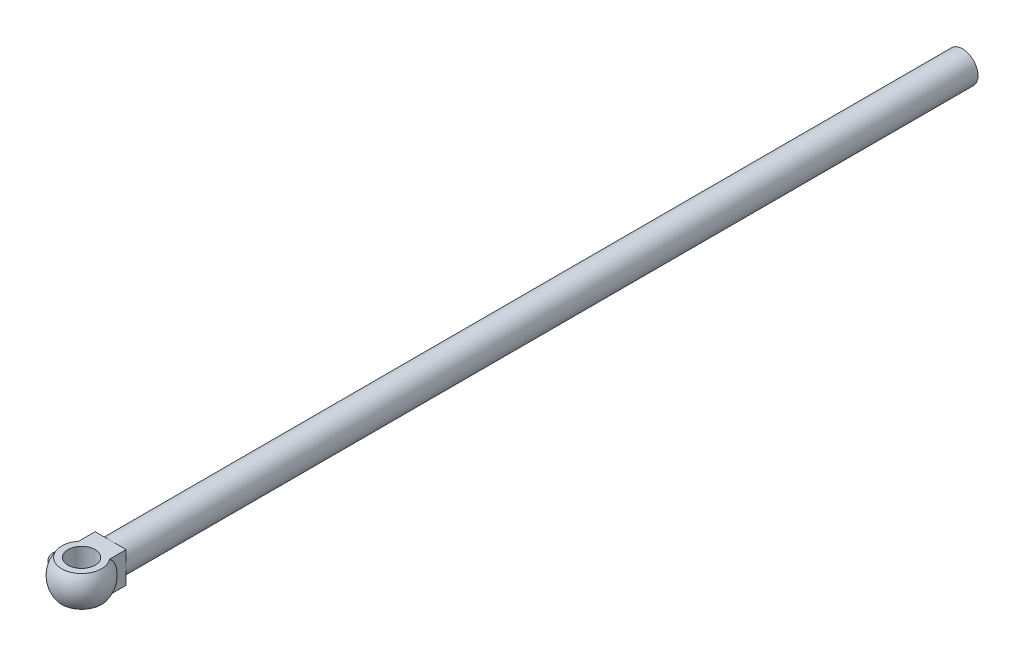
ISO-10303-21;
HEADER;
FILE_DESCRIPTION(('STEP AP214'),'2;1');
FILE_NAME('part.step','',(''),(''),'','','');
FILE_SCHEMA(('AUTOMOTIVE_DESIGN { 1 0 10303 214 1 1 1 1 }'));
ENDSEC;
DATA;
#1=APPLICATION_CONTEXT('core data for automotive mechanical design processes');
#2=APPLICATION_PROTOCOL_DEFINITION('international standard','automotive_design',2000,#1);
#3=PRODUCT_CONTEXT('',#1,'mechanical');
#4=PRODUCT('Part','Part','',(#3));
#5=PRODUCT_RELATED_PRODUCT_CATEGORY('part','',(#4));
#6=PRODUCT_DEFINITION_FORMATION('','',#4);
#7=PRODUCT_DEFINITION_CONTEXT('part definition',#1,'design');
#8=PRODUCT_DEFINITION('design','',#6,#7);
#9=PRODUCT_DEFINITION_SHAPE('','',#8);
#10=(LENGTH_UNIT() NAMED_UNIT(*) SI_UNIT(.MILLI.,.METRE.));
#11=(NAMED_UNIT(*) PLANE_ANGLE_UNIT() SI_UNIT($,.RADIAN.));
#12=(NAMED_UNIT(*) SI_UNIT($,.STERADIAN.) SOLID_ANGLE_UNIT());
#13=UNCERTAINTY_MEASURE_WITH_UNIT(LENGTH_MEASURE(1.E-05),#10,'distance_accuracy_value','');
#14=(GEOMETRIC_REPRESENTATION_CONTEXT(3) GLOBAL_UNCERTAINTY_ASSIGNED_CONTEXT((#13)) GLOBAL_UNIT_ASSIGNED_CONTEXT((#10,
#11,#12)) REPRESENTATION_CONTEXT('',''));
#15=CARTESIAN_POINT('',(0.,0.,0.));
#16=DIRECTION('',(0.,0.,1.));
#17=DIRECTION('',(1.,0.,0.));
#18=AXIS2_PLACEMENT_3D('',#15,#16,#17);
#19=CARTESIAN_POINT('',(0.,0.,-75.));
#20=DIRECTION('',(0.,0.,-1.));
#21=DIRECTION('',(-1.,0.,0.));
#22=AXIS2_PLACEMENT_3D('',#19,#20,#21);
#23=PLANE('',#22);
#24=CARTESIAN_POINT('',(0.,0.,-75.));
#25=DIRECTION('',(0.,0.,-1.));
#26=DIRECTION('',(-1.,0.,0.));
#27=AXIS2_PLACEMENT_3D('',#24,#25,#26);
#28=CIRCLE('',#27,40.);
#29=CARTESIAN_POINT('',(-40.,0.,-75.));
#30=VERTEX_POINT('',#29);
#31=CARTESIAN_POINT('',(0.,40.,-75.));
#32=VERTEX_POINT('',#31);
#33=EDGE_CURVE('E49',#30,#32,#28,.T.);
#34=ORIENTED_EDGE('',*,*,#33,.F.);
#35=DIRECTION('',(0.,-1.,0.));
#36=VECTOR('',#35,1.);
#37=CARTESIAN_POINT('',(-40.,-40.,-75.));
#38=LINE('',#37,#36);
#39=CARTESIAN_POINT('',(-40.,40.,-75.));
#40=VERTEX_POINT('',#39);
#41=EDGE_CURVE('E99',#40,#30,#38,.T.);
#42=ORIENTED_EDGE('',*,*,#41,.F.);
#43=DIRECTION('',(-1.,0.,0.));
#44=VECTOR('',#43,1.);
#45=CARTESIAN_POINT('',(-40.,40.,-75.));
#46=LINE('',#45,#44);
#47=EDGE_CURVE('E113',#32,#40,#46,.T.);
#48=ORIENTED_EDGE('',*,*,#47,.F.);
#49=EDGE_LOOP('',(#34,#42,#48));
#50=FACE_BOUND('',#49,.T.);
#51=ADVANCED_FACE('F38',(#50),#23,.T.);
#52=CARTESIAN_POINT('',(40.,0.,-75.));
#53=VERTEX_POINT('',#52);
#54=EDGE_CURVE('E11',#32,#53,#28,.T.);
#55=ORIENTED_EDGE('',*,*,#54,.F.);
#56=CARTESIAN_POINT('',(40.,40.,-75.));
#57=VERTEX_POINT('',#56);
#58=EDGE_CURVE('E142',#57,#32,#46,.T.);
#59=ORIENTED_EDGE('',*,*,#58,.F.);
#60=DIRECTION('',(0.,1.,0.));
#61=VECTOR('',#60,1.);
#62=CARTESIAN_POINT('',(40.,-40.,-75.));
#63=LINE('',#62,#61);
#64=EDGE_CURVE('E148',#53,#57,#63,.T.);
#65=ORIENTED_EDGE('',*,*,#64,.F.);
#66=EDGE_LOOP('',(#55,#59,#65));
#67=FACE_BOUND('',#66,.T.);
#68=ADVANCED_FACE('F193',(#67),#23,.T.);
#69=CARTESIAN_POINT('',(0.,-40.,-75.));
#70=VERTEX_POINT('',#69);
#71=EDGE_CURVE('E47',#53,#70,#28,.T.);
#72=ORIENTED_EDGE('',*,*,#71,.F.);
#73=CARTESIAN_POINT('',(40.,-40.,-75.));
#74=VERTEX_POINT('',#73);
#75=EDGE_CURVE('E144',#74,#53,#63,.T.);
#76=ORIENTED_EDGE('',*,*,#75,.F.);
#77=DIRECTION('',(1.,0.,0.));
#78=VECTOR('',#77,1.);
#79=CARTESIAN_POINT('',(-40.,-40.,-75.));
#80=LINE('',#79,#78);
#81=EDGE_CURVE('E140',#70,#74,#80,.T.);
#82=ORIENTED_EDGE('',*,*,#81,.F.);
#83=EDGE_LOOP('',(#72,#76,#82));
#84=FACE_BOUND('',#83,.T.);
#85=ADVANCED_FACE('F198',(#84),#23,.T.);
#86=CARTESIAN_POINT('',(0.,0.,0.));
#87=DIRECTION('',(0.,-1.,0.));
#88=DIRECTION('',(-1.,0.,0.));
#89=AXIS2_PLACEMENT_3D('',#86,#87,#88);
#90=SPHERICAL_SURFACE('',#89,65.);
#91=CARTESIAN_POINT('',(-63.7867541108654,0.,0.));
#92=DIRECTION('',(-1.,0.,0.));
#93=DIRECTION('',(0.,0.,1.));
#94=AXIS2_PLACEMENT_3D('',#91,#92,#93);
#95=CIRCLE('',#94,12.5);
#96=CARTESIAN_POINT('',(-63.7867541108654,0.,12.5));
#97=VERTEX_POINT('',#96);
#98=EDGE_CURVE('E133',#97,#97,#95,.T.);
#99=ORIENTED_EDGE('',*,*,#98,.F.);
#100=EDGE_LOOP('',(#99));
#101=FACE_BOUND('',#100,.T.);
#102=CARTESIAN_POINT('',(40.,0.,0.));
#103=DIRECTION('',(-1.,0.,0.));
#104=DIRECTION('',(0.,0.,1.));
#105=AXIS2_PLACEMENT_3D('',#102,#103,#104);
#106=CIRCLE('',#105,51.234753829798);
#107=CARTESIAN_POINT('',(40.,-40.,-32.0156211871643));
#108=VERTEX_POINT('',#107);
#109=CARTESIAN_POINT('',(40.,40.,-32.0156211871643));
#110=VERTEX_POINT('',#109);
#111=EDGE_CURVE('E139',#108,#110,#106,.F.);
#112=ORIENTED_EDGE('',*,*,#111,.T.);
#113=CARTESIAN_POINT('',(0.,40.,0.));
#114=DIRECTION('',(0.,-1.,0.));
#115=DIRECTION('',(0.,0.,-1.));
#116=AXIS2_PLACEMENT_3D('',#113,#114,#115);
#117=CIRCLE('',#116,51.234753829798);
#118=CARTESIAN_POINT('',(-40.,40.,-32.0156211871642));
#119=VERTEX_POINT('',#118);
#120=EDGE_CURVE('E169',#110,#119,#117,.T.);
#121=ORIENTED_EDGE('',*,*,#120,.T.);
#122=CARTESIAN_POINT('',(-40.,0.,0.));
#123=DIRECTION('',(1.,0.,0.));
#124=DIRECTION('',(0.,0.,-1.));
#125=AXIS2_PLACEMENT_3D('',#122,#123,#124);
#126=CIRCLE('',#125,51.234753829798);
#127=CARTESIAN_POINT('',(-40.,-40.,-32.0156211871642));
#128=VERTEX_POINT('',#127);
#129=EDGE_CURVE('E151',#119,#128,#126,.F.);
#130=ORIENTED_EDGE('',*,*,#129,.T.);
#131=CARTESIAN_POINT('',(0.,-40.,0.));
#132=DIRECTION('',(0.,-1.,0.));
#133=DIRECTION('',(0.,0.,-1.));
#134=AXIS2_PLACEMENT_3D('',#131,#132,#133);
#135=CIRCLE('',#134,51.234753829798);
#136=EDGE_CURVE('E166',#108,#128,#135,.T.);
#137=ORIENTED_EDGE('',*,*,#136,.F.);
#138=EDGE_LOOP('',(#112,#121,#130,#137));
#139=FACE_BOUND('',#138,.T.);
#140=ADVANCED_FACE('F209',(#101,#139),#90,.T.);
#141=CARTESIAN_POINT('',(-35.,40.,0.));
#142=DIRECTION('',(0.,-1.,0.));
#143=DIRECTION('',(0.,0.,-1.));
#144=AXIS2_PLACEMENT_3D('',#141,#142,#143);
#145=PLANE('',#144);
#146=ORIENTED_EDGE('',*,*,#120,.F.);
#147=DIRECTION('',(0.,0.,-1.));
#148=VECTOR('',#147,1.);
#149=CARTESIAN_POINT('',(40.,40.,65.001));
#150=LINE('',#149,#148);
#151=EDGE_CURVE('E147',#110,#57,#150,.T.);
#152=ORIENTED_EDGE('',*,*,#151,.T.);
#153=ORIENTED_EDGE('',*,*,#58,.T.);
#154=ORIENTED_EDGE('',*,*,#47,.T.);
#155=DIRECTION('',(0.,0.,-1.));
#156=VECTOR('',#155,1.);
#157=CARTESIAN_POINT('',(-40.,40.,65.001));
#158=LINE('',#157,#156);
#159=EDGE_CURVE('E104',#119,#40,#158,.T.);
#160=ORIENTED_EDGE('',*,*,#159,.F.);
#161=EDGE_LOOP('',(#146,#152,#153,#154,#160));
#162=FACE_BOUND('',#161,.T.);
#163=CARTESIAN_POINT('',(0.,40.,0.));
#164=DIRECTION('',(0.,-1.,0.));
#165=DIRECTION('',(0.,0.,-1.));
#166=AXIS2_PLACEMENT_3D('',#163,#164,#165);
#167=CIRCLE('',#166,35.);
#168=CARTESIAN_POINT('',(0.,40.,-35.));
#169=VERTEX_POINT('',#168);
#170=EDGE_CURVE('E158',#169,#169,#167,.T.);
#171=ORIENTED_EDGE('',*,*,#170,.T.);
#172=EDGE_LOOP('',(#171));
#173=FACE_BOUND('',#172,.T.);
#174=ADVANCED_FACE('F214',(#162,#173),#145,.F.);
#175=CARTESIAN_POINT('',(-35.,-40.,0.));
#176=DIRECTION('',(0.,1.,0.));
#177=DIRECTION('',(0.,0.,1.));
#178=AXIS2_PLACEMENT_3D('',#175,#176,#177);
#179=PLANE('',#178);
#180=CARTESIAN_POINT('',(0.,-40.,0.));
#181=DIRECTION('',(0.,-1.,0.));
#182=DIRECTION('',(0.,0.,-1.));
#183=AXIS2_PLACEMENT_3D('',#180,#181,#182);
#184=CIRCLE('',#183,35.);
#185=CARTESIAN_POINT('',(0.,-40.,-35.));
#186=VERTEX_POINT('',#185);
#187=EDGE_CURVE('E163',#186,#186,#184,.T.);
#188=ORIENTED_EDGE('',*,*,#187,.F.);
#189=EDGE_LOOP('',(#188));
#190=FACE_BOUND('',#189,.T.);
#191=ORIENTED_EDGE('',*,*,#136,.T.);
#192=DIRECTION('',(0.,0.,-1.));
#193=VECTOR('',#192,1.);
#194=CARTESIAN_POINT('',(-40.,-40.,65.001));
#195=LINE('',#194,#193);
#196=CARTESIAN_POINT('',(-40.,-40.,-75.));
#197=VERTEX_POINT('',#196);
#198=EDGE_CURVE('E107',#128,#197,#195,.T.);
#199=ORIENTED_EDGE('',*,*,#198,.T.);
#200=EDGE_CURVE('E111',#197,#70,#80,.T.);
#201=ORIENTED_EDGE('',*,*,#200,.T.);
#202=ORIENTED_EDGE('',*,*,#81,.T.);
#203=DIRECTION('',(0.,0.,-1.));
#204=VECTOR('',#203,1.);
#205=CARTESIAN_POINT('',(40.,-40.,65.001));
#206=LINE('',#205,#204);
#207=EDGE_CURVE('E138',#108,#74,#206,.T.);
#208=ORIENTED_EDGE('',*,*,#207,.F.);
#209=EDGE_LOOP('',(#191,#199,#201,#202,#208));
#210=FACE_BOUND('',#209,.T.);
#211=ADVANCED_FACE('F222',(#190,#210),#179,.F.);
#212=CARTESIAN_POINT('',(0.,0.,0.));
#213=DIRECTION('',(0.,-1.,0.));
#214=DIRECTION('',(0.,0.,-1.));
#215=AXIS2_PLACEMENT_3D('',#212,#213,#214);
#216=CYLINDRICAL_SURFACE('',#215,35.);
#217=ORIENTED_EDGE('',*,*,#170,.F.);
#218=EDGE_LOOP('',(#217));
#219=FACE_BOUND('',#218,.T.);
#220=ORIENTED_EDGE('',*,*,#187,.T.);
#221=EDGE_LOOP('',(#220));
#222=FACE_BOUND('',#221,.T.);
#223=ADVANCED_FACE('F230',(#219,#222),#216,.F.);
#224=CARTESIAN_POINT('',(40.,-40.,65.001));
#225=DIRECTION('',(-1.,0.,0.));
#226=DIRECTION('',(0.,0.,1.));
#227=AXIS2_PLACEMENT_3D('',#224,#225,#226);
#228=PLANE('',#227);
#229=ORIENTED_EDGE('',*,*,#111,.F.);
#230=ORIENTED_EDGE('',*,*,#207,.T.);
#231=ORIENTED_EDGE('',*,*,#75,.T.);
#232=ORIENTED_EDGE('',*,*,#64,.T.);
#233=ORIENTED_EDGE('',*,*,#151,.F.);
#234=EDGE_LOOP('',(#229,#230,#231,#232,#233));
#235=FACE_BOUND('',#234,.T.);
#236=ADVANCED_FACE('F207',(#235),#228,.F.);
#237=CARTESIAN_POINT('',(-40.,-40.,65.001));
#238=DIRECTION('',(1.,0.,0.));
#239=DIRECTION('',(0.,0.,-1.));
#240=AXIS2_PLACEMENT_3D('',#237,#238,#239);
#241=PLANE('',#240);
#242=ORIENTED_EDGE('',*,*,#129,.F.);
#243=ORIENTED_EDGE('',*,*,#159,.T.);
#244=ORIENTED_EDGE('',*,*,#41,.T.);
#245=EDGE_CURVE('E101',#30,#197,#38,.T.);
#246=ORIENTED_EDGE('',*,*,#245,.T.);
#247=ORIENTED_EDGE('',*,*,#198,.F.);
#248=EDGE_LOOP('',(#242,#243,#244,#246,#247));
#249=FACE_BOUND('',#248,.T.);
#250=ADVANCED_FACE('F100',(#249),#241,.F.);
#251=EDGE_CURVE('E62',#70,#30,#28,.T.);
#252=ORIENTED_EDGE('',*,*,#251,.F.);
#253=ORIENTED_EDGE('',*,*,#200,.F.);
#254=ORIENTED_EDGE('',*,*,#245,.F.);
#255=EDGE_LOOP('',(#252,#253,#254));
#256=FACE_BOUND('',#255,.T.);
#257=ADVANCED_FACE('F109',(#256),#23,.T.);
#258=CARTESIAN_POINT('',(-75.7867541108654,0.,0.));
#259=DIRECTION('',(-1.,0.,0.));
#260=DIRECTION('',(0.,0.,1.));
#261=AXIS2_PLACEMENT_3D('',#258,#259,#260);
#262=PLANE('',#261);
#263=CARTESIAN_POINT('',(-75.7867541108654,0.,0.));
#264=DIRECTION('',(-1.,0.,0.));
#265=DIRECTION('',(0.,0.,1.));
#266=AXIS2_PLACEMENT_3D('',#263,#264,#265);
#267=CIRCLE('',#266,11.5000000000001);
#268=CARTESIAN_POINT('',(-75.7867541108654,0.,11.5000000000001));
#269=VERTEX_POINT('',#268);
#270=EDGE_CURVE('E120',#269,#269,#267,.T.);
#271=ORIENTED_EDGE('',*,*,#270,.T.);
#272=EDGE_LOOP('',(#271));
#273=FACE_BOUND('',#272,.T.);
#274=CARTESIAN_POINT('',(-75.7867541108654,0.,0.));
#275=DIRECTION('',(-1.,0.,0.));
#276=DIRECTION('',(0.,0.,1.));
#277=AXIS2_PLACEMENT_3D('',#274,#275,#276);
#278=CIRCLE('',#277,10.5);
#279=CARTESIAN_POINT('',(-75.7867541108654,0.,10.5));
#280=VERTEX_POINT('',#279);
#281=EDGE_CURVE('E130',#280,#280,#278,.T.);
#282=ORIENTED_EDGE('',*,*,#281,.F.);
#283=EDGE_LOOP('',(#282));
#284=FACE_BOUND('',#283,.T.);
#285=ADVANCED_FACE('F174',(#273,#284),#262,.T.);
#286=CARTESIAN_POINT('',(-75.7867541108654,0.,0.));
#287=DIRECTION('',(1.,0.,0.));
#288=DIRECTION('',(0.,0.,-1.));
#289=AXIS2_PLACEMENT_3D('',#286,#287,#288);
#290=CYLINDRICAL_SURFACE('',#289,12.5);
#291=CARTESIAN_POINT('',(-74.7867541108654,0.,0.));
#292=DIRECTION('',(-1.,0.,0.));
#293=DIRECTION('',(0.,0.,1.));
#294=AXIS2_PLACEMENT_3D('',#291,#292,#293);
#295=CIRCLE('',#294,12.5);
#296=CARTESIAN_POINT('',(-74.7867541108654,0.,12.5));
#297=VERTEX_POINT('',#296);
#298=EDGE_CURVE('E42',#297,#297,#295,.F.);
#299=ORIENTED_EDGE('',*,*,#298,.T.);
#300=EDGE_LOOP('',(#299));
#301=FACE_BOUND('',#300,.T.);
#302=ORIENTED_EDGE('',*,*,#98,.T.);
#303=EDGE_LOOP('',(#302));
#304=FACE_BOUND('',#303,.T.);
#305=ADVANCED_FACE('F205',(#301,#304),#290,.T.);
#306=CARTESIAN_POINT('',(-75.7867541108654,0.,0.));
#307=DIRECTION('',(1.,0.,0.));
#308=DIRECTION('',(0.,0.,-1.));
#309=AXIS2_PLACEMENT_3D('',#306,#307,#308);
#310=CYLINDRICAL_SURFACE('',#309,10.5);
#311=ORIENTED_EDGE('',*,*,#281,.T.);
#312=EDGE_LOOP('',(#311));
#313=FACE_BOUND('',#312,.T.);
#314=CARTESIAN_POINT('',(-63.7867541108654,0.,0.));
#315=DIRECTION('',(-1.,0.,0.));
#316=DIRECTION('',(0.,0.,1.));
#317=AXIS2_PLACEMENT_3D('',#314,#315,#316);
#318=CIRCLE('',#317,10.5);
#319=CARTESIAN_POINT('',(-63.7867541108654,0.,10.5));
#320=VERTEX_POINT('',#319);
#321=EDGE_CURVE('E129',#320,#320,#318,.T.);
#322=ORIENTED_EDGE('',*,*,#321,.F.);
#323=EDGE_LOOP('',(#322));
#324=FACE_BOUND('',#323,.T.);
#325=ADVANCED_FACE('F188',(#313,#324),#310,.F.);
#326=CARTESIAN_POINT('',(-63.7867541108654,-30.,-31.0650908997583));
#327=DIRECTION('',(1.,0.,0.));
#328=DIRECTION('',(0.,0.,-1.));
#329=AXIS2_PLACEMENT_3D('',#326,#327,#328);
#330=PLANE('',#329);
#331=CARTESIAN_POINT('',(-63.7867541108654,0.,0.));
#332=DIRECTION('',(-1.,0.,0.));
#333=DIRECTION('',(0.,0.,1.));
#334=AXIS2_PLACEMENT_3D('',#331,#332,#333);
#335=CIRCLE('',#334,4.49999999999999);
#336=CARTESIAN_POINT('',(-63.7867541108654,0.,4.5));
#337=VERTEX_POINT('',#336);
#338=EDGE_CURVE('E123',#337,#337,#335,.T.);
#339=ORIENTED_EDGE('',*,*,#338,.F.);
#340=EDGE_LOOP('',(#339));
#341=FACE_BOUND('',#340,.T.);
#342=ORIENTED_EDGE('',*,*,#321,.T.);
#343=EDGE_LOOP('',(#342));
#344=FACE_BOUND('',#343,.T.);
#345=ADVANCED_FACE('F179',(#341,#344),#330,.F.);
#346=CARTESIAN_POINT('',(-75.7867541108654,0.,0.));
#347=DIRECTION('',(1.,0.,0.));
#348=DIRECTION('',(0.,0.,-1.));
#349=AXIS2_PLACEMENT_3D('',#346,#347,#348);
#350=CONICAL_SURFACE('',#349,11.5000000000001,0.785398163397438);
#351=ORIENTED_EDGE('',*,*,#298,.F.);
#352=EDGE_LOOP('',(#351));
#353=FACE_BOUND('',#352,.T.);
#354=ORIENTED_EDGE('',*,*,#270,.F.);
#355=EDGE_LOOP('',(#354));
#356=FACE_BOUND('',#355,.T.);
#357=ADVANCED_FACE('F40',(#353,#356),#350,.T.);
#358=CARTESIAN_POINT('',(-40.7867541108654,0.,0.));
#359=DIRECTION('',(-1.,0.,0.));
#360=DIRECTION('',(0.,0.,1.));
#361=AXIS2_PLACEMENT_3D('',#358,#359,#360);
#362=CONICAL_SURFACE('',#361,4.49999999999999,1.02974425867665);
#363=CARTESIAN_POINT('',(-38.0828813252414,0.,0.));
#364=VERTEX_POINT('',#363);
#365=VERTEX_LOOP('',#364);
#366=FACE_BOUND('',#365,.T.);
#367=CARTESIAN_POINT('',(-40.7867541108654,0.,0.));
#368=DIRECTION('',(-1.,0.,0.));
#369=DIRECTION('',(0.,0.,1.));
#370=AXIS2_PLACEMENT_3D('',#367,#368,#369);
#371=CIRCLE('',#370,4.49999999999999);
#372=CARTESIAN_POINT('',(-40.7867541108654,0.,4.5));
#373=VERTEX_POINT('',#372);
#374=EDGE_CURVE('E126',#373,#373,#371,.T.);
#375=ORIENTED_EDGE('',*,*,#374,.T.);
#376=EDGE_LOOP('',(#375));
#377=FACE_BOUND('',#376,.T.);
#378=ADVANCED_FACE('F178',(#366,#377),#362,.F.);
#379=CARTESIAN_POINT('',(-63.7867541108654,0.,0.));
#380=DIRECTION('',(-1.,0.,0.));
#381=DIRECTION('',(0.,0.,1.));
#382=AXIS2_PLACEMENT_3D('',#379,#380,#381);
#383=CYLINDRICAL_SURFACE('',#382,4.49999999999999);
#384=ORIENTED_EDGE('',*,*,#374,.F.);
#385=EDGE_LOOP('',(#384));
#386=FACE_BOUND('',#385,.T.);
#387=ORIENTED_EDGE('',*,*,#338,.T.);
#388=EDGE_LOOP('',(#387));
#389=FACE_BOUND('',#388,.T.);
#390=ADVANCED_FACE('F185',(#386,#389),#383,.F.);
#391=CARTESIAN_POINT('',(0.,0.,-2275.));
#392=DIRECTION('',(0.,0.,1.));
#393=DIRECTION('',(1.,0.,0.));
#394=AXIS2_PLACEMENT_3D('',#391,#392,#393);
#395=CYLINDRICAL_SURFACE('',#394,40.);
#396=CARTESIAN_POINT('',(0.,0.,-2275.));
#397=DIRECTION('',(0.,0.,-1.));
#398=DIRECTION('',(-1.,0.,0.));
#399=AXIS2_PLACEMENT_3D('',#396,#397,#398);
#400=CIRCLE('',#399,40.);
#401=CARTESIAN_POINT('',(-40.,0.,-2275.));
#402=VERTEX_POINT('',#401);
#403=EDGE_CURVE('E116',#402,#402,#400,.T.);
#404=ORIENTED_EDGE('',*,*,#403,.F.);
#405=EDGE_LOOP('',(#404));
#406=FACE_BOUND('',#405,.T.);
#407=ORIENTED_EDGE('',*,*,#33,.T.);
#408=ORIENTED_EDGE('',*,*,#54,.T.);
#409=ORIENTED_EDGE('',*,*,#71,.T.);
#410=ORIENTED_EDGE('',*,*,#251,.T.);
#411=EDGE_LOOP('',(#407,#408,#409,#410));
#412=FACE_BOUND('',#411,.T.);
#413=ADVANCED_FACE('F118',(#406,#412),#395,.T.);
#414=CARTESIAN_POINT('',(0.,0.,-2275.));
#415=DIRECTION('',(0.,0.,-1.));
#416=DIRECTION('',(-1.,0.,0.));
#417=AXIS2_PLACEMENT_3D('',#414,#415,#416);
#418=PLANE('',#417);
#419=ORIENTED_EDGE('',*,*,#403,.T.);
#420=EDGE_LOOP('',(#419));
#421=FACE_BOUND('',#420,.T.);
#422=ADVANCED_FACE('F265',(#421),#418,.T.);
#423=CLOSED_SHELL('',(#51,#68,#85,#140,#174,#211,#223,#236,#250,#257,#285,#305,#325,#345,#357,
#378,#390,#413,#422));
#424=MANIFOLD_SOLID_BREP('B2',#423);
#425=ADVANCED_BREP_SHAPE_REPRESENTATION('',(#18,#424),#14);
#426=SHAPE_DEFINITION_REPRESENTATION(#9,#425);
ENDSEC;
END-ISO-10303-21;
